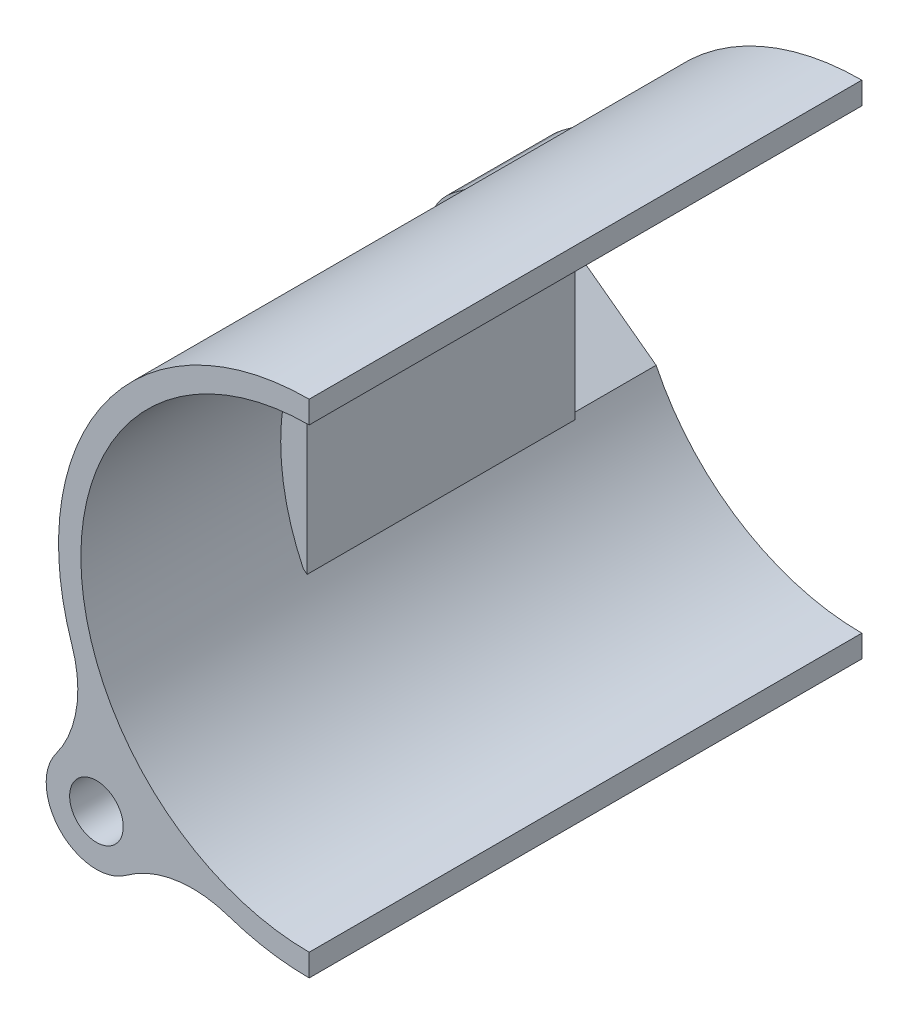
ISO-10303-21;
HEADER;
FILE_DESCRIPTION(('STEP AP214'),'2;1');
FILE_NAME('part.step','',(''),(''),'','','');
FILE_SCHEMA(('AUTOMOTIVE_DESIGN { 1 0 10303 214 1 1 1 1 }'));
ENDSEC;
DATA;
#1=APPLICATION_CONTEXT('core data for automotive mechanical design processes');
#2=APPLICATION_PROTOCOL_DEFINITION('international standard','automotive_design',2000,#1);
#3=PRODUCT_CONTEXT('',#1,'mechanical');
#4=PRODUCT('Part','Part','',(#3));
#5=PRODUCT_RELATED_PRODUCT_CATEGORY('part','',(#4));
#6=PRODUCT_DEFINITION_FORMATION('','',#4);
#7=PRODUCT_DEFINITION_CONTEXT('part definition',#1,'design');
#8=PRODUCT_DEFINITION('design','',#6,#7);
#9=PRODUCT_DEFINITION_SHAPE('','',#8);
#10=(LENGTH_UNIT() NAMED_UNIT(*) SI_UNIT(.MILLI.,.METRE.));
#11=(NAMED_UNIT(*) PLANE_ANGLE_UNIT() SI_UNIT($,.RADIAN.));
#12=(NAMED_UNIT(*) SI_UNIT($,.STERADIAN.) SOLID_ANGLE_UNIT());
#13=UNCERTAINTY_MEASURE_WITH_UNIT(LENGTH_MEASURE(1.E-05),#10,'distance_accuracy_value','');
#14=(GEOMETRIC_REPRESENTATION_CONTEXT(3) GLOBAL_UNCERTAINTY_ASSIGNED_CONTEXT((#13)) GLOBAL_UNIT_ASSIGNED_CONTEXT((#10,
#11,#12)) REPRESENTATION_CONTEXT('',''));
#15=CARTESIAN_POINT('',(0.,0.,0.));
#16=DIRECTION('',(0.,0.,1.));
#17=DIRECTION('',(1.,0.,0.));
#18=AXIS2_PLACEMENT_3D('',#15,#16,#17);
#19=CARTESIAN_POINT('',(0.,0.,0.));
#20=DIRECTION('',(1.,0.,0.));
#21=DIRECTION('',(0.,0.,-1.));
#22=AXIS2_PLACEMENT_3D('',#19,#20,#21);
#23=PLANE('',#22);
#24=DIRECTION('',(0.,0.,-1.));
#25=VECTOR('',#24,1.);
#26=CARTESIAN_POINT('',(0.,-22.45,49.5));
#27=LINE('',#26,#25);
#28=CARTESIAN_POINT('',(0.,-22.45,49.5));
#29=VERTEX_POINT('',#28);
#30=CARTESIAN_POINT('',(0.,-22.45,0.));
#31=VERTEX_POINT('',#30);
#32=EDGE_CURVE('E305',#29,#31,#27,.T.);
#33=ORIENTED_EDGE('',*,*,#32,.T.);
#34=DIRECTION('',(0.,1.,0.));
#35=VECTOR('',#34,1.);
#36=CARTESIAN_POINT('',(0.,0.,0.));
#37=LINE('',#36,#35);
#38=CARTESIAN_POINT('',(0.,-20.45,0.));
#39=VERTEX_POINT('',#38);
#40=EDGE_CURVE('E220',#31,#39,#37,.T.);
#41=ORIENTED_EDGE('',*,*,#40,.T.);
#42=DIRECTION('',(0.,0.,-1.));
#43=VECTOR('',#42,1.);
#44=CARTESIAN_POINT('',(0.,-20.45,49.5));
#45=LINE('',#44,#43);
#46=CARTESIAN_POINT('',(0.,-20.45,49.5));
#47=VERTEX_POINT('',#46);
#48=EDGE_CURVE('E213',#47,#39,#45,.T.);
#49=ORIENTED_EDGE('',*,*,#48,.F.);
#50=DIRECTION('',(0.,1.,0.));
#51=VECTOR('',#50,1.);
#52=CARTESIAN_POINT('',(0.,0.,49.5));
#53=LINE('',#52,#51);
#54=EDGE_CURVE('E212',#29,#47,#53,.T.);
#55=ORIENTED_EDGE('',*,*,#54,.F.);
#56=EDGE_LOOP('',(#33,#41,#49,#55));
#57=FACE_BOUND('',#56,.T.);
#58=ADVANCED_FACE('F44',(#57),#23,.T.);
#59=DIRECTION('',(0.,0.,-1.));
#60=VECTOR('',#59,1.);
#61=CARTESIAN_POINT('',(0.,20.45,49.5));
#62=LINE('',#61,#60);
#63=CARTESIAN_POINT('',(0.,20.45,0.));
#64=VERTEX_POINT('',#63);
#65=CARTESIAN_POINT('',(0.,20.45,49.5));
#66=VERTEX_POINT('',#65);
#67=EDGE_CURVE('E195',#64,#66,#62,.F.);
#68=ORIENTED_EDGE('',*,*,#67,.F.);
#69=CARTESIAN_POINT('',(0.,22.45,0.));
#70=VERTEX_POINT('',#69);
#71=EDGE_CURVE('E210',#64,#70,#37,.T.);
#72=ORIENTED_EDGE('',*,*,#71,.T.);
#73=DIRECTION('',(0.,0.,-1.));
#74=VECTOR('',#73,1.);
#75=CARTESIAN_POINT('',(0.,22.45,49.5));
#76=LINE('',#75,#74);
#77=CARTESIAN_POINT('',(0.,22.45,49.5));
#78=VERTEX_POINT('',#77);
#79=EDGE_CURVE('E223',#70,#78,#76,.F.);
#80=ORIENTED_EDGE('',*,*,#79,.T.);
#81=EDGE_CURVE('E211',#66,#78,#53,.T.);
#82=ORIENTED_EDGE('',*,*,#81,.F.);
#83=EDGE_LOOP('',(#68,#72,#80,#82));
#84=FACE_BOUND('',#83,.T.);
#85=ADVANCED_FACE('F208',(#84),#23,.T.);
#86=CARTESIAN_POINT('',(-23.1,0.,9.6));
#87=DIRECTION('',(0.,0.,1.));
#88=DIRECTION('',(1.,0.,0.));
#89=AXIS2_PLACEMENT_3D('',#86,#87,#88);
#90=CYLINDRICAL_SURFACE('',#89,2.24999999999999);
#91=CARTESIAN_POINT('',(-23.1,0.,9.6));
#92=DIRECTION('',(0.,0.,1.));
#93=DIRECTION('',(1.,0.,0.));
#94=AXIS2_PLACEMENT_3D('',#91,#92,#93);
#95=CIRCLE('',#94,2.24999999999999);
#96=CARTESIAN_POINT('',(-20.85,0.,9.6));
#97=VERTEX_POINT('',#96);
#98=EDGE_CURVE('E249',#97,#97,#95,.T.);
#99=ORIENTED_EDGE('',*,*,#98,.T.);
#100=EDGE_LOOP('',(#99));
#101=FACE_BOUND('',#100,.T.);
#102=CARTESIAN_POINT('',(-23.1,0.,7.6));
#103=DIRECTION('',(0.,0.,1.));
#104=DIRECTION('',(1.,0.,0.));
#105=AXIS2_PLACEMENT_3D('',#102,#103,#104);
#106=CIRCLE('',#105,2.24999999999999);
#107=CARTESIAN_POINT('',(-20.85,0.,7.6));
#108=VERTEX_POINT('',#107);
#109=EDGE_CURVE('E253',#108,#108,#106,.T.);
#110=ORIENTED_EDGE('',*,*,#109,.F.);
#111=EDGE_LOOP('',(#110));
#112=FACE_BOUND('',#111,.T.);
#113=ADVANCED_FACE('F421',(#101,#112),#90,.F.);
#114=CARTESIAN_POINT('',(-18.0802086799942,0.,29.6));
#115=DIRECTION('',(1.,0.,0.));
#116=DIRECTION('',(0.,1.,0.));
#117=AXIS2_PLACEMENT_3D('',#114,#115,#116);
#118=PLANE('',#117);
#119=DIRECTION('',(0.,-1.,0.));
#120=VECTOR('',#119,1.);
#121=CARTESIAN_POINT('',(-18.0802086799942,0.,7.6));
#122=LINE('',#121,#120);
#123=CARTESIAN_POINT('',(-18.0802086799942,9.13194781106274,7.6));
#124=VERTEX_POINT('',#123);
#125=CARTESIAN_POINT('',(-18.0802086799942,-9.13194781106274,7.6));
#126=VERTEX_POINT('',#125);
#127=EDGE_CURVE('E279',#124,#126,#122,.T.);
#128=ORIENTED_EDGE('',*,*,#127,.F.);
#129=DIRECTION('',(0.,0.,-1.));
#130=VECTOR('',#129,1.);
#131=CARTESIAN_POINT('',(-18.0802086799942,9.13194781106274,29.6));
#132=LINE('',#131,#130);
#133=CARTESIAN_POINT('',(-18.0802086799942,9.13194781106274,31.6));
#134=VERTEX_POINT('',#133);
#135=EDGE_CURVE('E274',#134,#124,#132,.T.);
#136=ORIENTED_EDGE('',*,*,#135,.F.);
#137=DIRECTION('',(0.,1.,0.));
#138=VECTOR('',#137,1.);
#139=CARTESIAN_POINT('',(-18.0802086799942,0.,31.6));
#140=LINE('',#139,#138);
#141=CARTESIAN_POINT('',(-18.0802086799942,-9.13194781106274,31.6));
#142=VERTEX_POINT('',#141);
#143=EDGE_CURVE('E285',#142,#134,#140,.T.);
#144=ORIENTED_EDGE('',*,*,#143,.F.);
#145=DIRECTION('',(0.,0.,-1.));
#146=VECTOR('',#145,1.);
#147=CARTESIAN_POINT('',(-18.0802086799942,-9.13194781106274,29.6));
#148=LINE('',#147,#146);
#149=EDGE_CURVE('E271',#142,#126,#148,.T.);
#150=ORIENTED_EDGE('',*,*,#149,.T.);
#151=EDGE_LOOP('',(#128,#136,#144,#150));
#152=FACE_BOUND('',#151,.T.);
#153=ADVANCED_FACE('F417',(#152),#118,.T.);
#154=CARTESIAN_POINT('',(0.,0.,7.6));
#155=DIRECTION('',(0.,0.,1.));
#156=DIRECTION('',(1.,0.,0.));
#157=AXIS2_PLACEMENT_3D('',#154,#155,#156);
#158=PLANE('',#157);
#159=DIRECTION('',(-0.803549382413629,0.595238095238095,0.));
#160=VECTOR('',#159,1.);
#161=CARTESIAN_POINT('',(-10.7738095238095,-14.5442438216867,7.6));
#162=LINE('',#161,#160);
#163=CARTESIAN_POINT('',(-18.421999974947,-8.87876212785612,7.6));
#164=VERTEX_POINT('',#163);
#165=EDGE_CURVE('E273',#126,#164,#162,.T.);
#166=ORIENTED_EDGE('',*,*,#165,.T.);
#167=DIRECTION('',(0.803549382413629,-0.595238095238095,0.));
#168=VECTOR('',#167,1.);
#169=CARTESIAN_POINT('',(-10.7738095238095,-14.5442438216867,7.6));
#170=LINE('',#169,#168);
#171=CARTESIAN_POINT('',(-25.6892857142857,-3.49543981349928,7.6));
#172=VERTEX_POINT('',#171);
#173=EDGE_CURVE('E242',#172,#164,#170,.T.);
#174=ORIENTED_EDGE('',*,*,#173,.F.);
#175=CARTESIAN_POINT('',(-23.1,0.,7.6));
#176=DIRECTION('',(0.,0.,1.));
#177=DIRECTION('',(1.,0.,0.));
#178=AXIS2_PLACEMENT_3D('',#175,#176,#177);
#179=CIRCLE('',#178,4.34999999999999);
#180=CARTESIAN_POINT('',(-25.6892857142857,3.49543981349928,7.6));
#181=VERTEX_POINT('',#180);
#182=EDGE_CURVE('E244',#181,#172,#179,.T.);
#183=ORIENTED_EDGE('',*,*,#182,.F.);
#184=DIRECTION('',(-0.803549382413629,-0.595238095238095,0.));
#185=VECTOR('',#184,1.);
#186=CARTESIAN_POINT('',(-10.7738095238095,14.5442438216867,7.6));
#187=LINE('',#186,#185);
#188=CARTESIAN_POINT('',(-18.421999974947,8.87876212785612,7.6));
#189=VERTEX_POINT('',#188);
#190=EDGE_CURVE('E246',#189,#181,#187,.T.);
#191=ORIENTED_EDGE('',*,*,#190,.F.);
#192=DIRECTION('',(0.803549382413629,0.595238095238095,0.));
#193=VECTOR('',#192,1.);
#194=CARTESIAN_POINT('',(-10.7738095238095,14.5442438216867,7.6));
#195=LINE('',#194,#193);
#196=EDGE_CURVE('E282',#189,#124,#195,.T.);
#197=ORIENTED_EDGE('',*,*,#196,.T.);
#198=ORIENTED_EDGE('',*,*,#127,.T.);
#199=EDGE_LOOP('',(#166,#174,#183,#191,#197,#198));
#200=FACE_BOUND('',#199,.T.);
#201=ORIENTED_EDGE('',*,*,#109,.T.);
#202=EDGE_LOOP('',(#201));
#203=FACE_BOUND('',#202,.T.);
#204=ADVANCED_FACE('F410',(#200,#203),#158,.F.);
#205=CARTESIAN_POINT('',(0.,0.,29.6));
#206=DIRECTION('',(0.,0.,1.));
#207=DIRECTION('',(1.,0.,0.));
#208=AXIS2_PLACEMENT_3D('',#205,#206,#207);
#209=PLANE('',#208);
#210=CARTESIAN_POINT('',(0.,0.,29.6));
#211=DIRECTION('',(0.,0.,1.));
#212=DIRECTION('',(1.,0.,0.));
#213=AXIS2_PLACEMENT_3D('',#210,#211,#212);
#214=CIRCLE('',#213,22.45);
#215=CARTESIAN_POINT('',(-19.0802086799942,11.8299677399337,29.6));
#216=VERTEX_POINT('',#215);
#217=CARTESIAN_POINT('',(-19.0802086799942,-11.8299677399337,29.6));
#218=VERTEX_POINT('',#217);
#219=EDGE_CURVE('E258',#216,#218,#214,.T.);
#220=ORIENTED_EDGE('',*,*,#219,.F.);
#221=DIRECTION('',(0.,-1.,0.));
#222=VECTOR('',#221,1.);
#223=CARTESIAN_POINT('',(-19.0802086799942,0.,29.6));
#224=LINE('',#223,#222);
#225=EDGE_CURVE('E262',#216,#218,#224,.T.);
#226=ORIENTED_EDGE('',*,*,#225,.T.);
#227=EDGE_LOOP('',(#220,#226));
#228=FACE_BOUND('',#227,.T.);
#229=ADVANCED_FACE('F408',(#228),#209,.F.);
#230=CARTESIAN_POINT('',(-19.0802086799942,0.,29.6));
#231=DIRECTION('',(1.,0.,0.));
#232=DIRECTION('',(0.,1.,0.));
#233=AXIS2_PLACEMENT_3D('',#230,#231,#232);
#234=PLANE('',#233);
#235=DIRECTION('',(0.,-1.,0.));
#236=VECTOR('',#235,1.);
#237=CARTESIAN_POINT('',(-19.0802086799942,0.,9.6));
#238=LINE('',#237,#236);
#239=CARTESIAN_POINT('',(-19.0802086799942,11.8299677399337,9.6));
#240=VERTEX_POINT('',#239);
#241=CARTESIAN_POINT('',(-19.0802086799942,-11.8299677399337,9.6));
#242=VERTEX_POINT('',#241);
#243=EDGE_CURVE('E261',#240,#242,#238,.T.);
#244=ORIENTED_EDGE('',*,*,#243,.T.);
#245=DIRECTION('',(0.,0.,-1.));
#246=VECTOR('',#245,1.);
#247=CARTESIAN_POINT('',(-19.0802086799942,-11.8299677399337,29.6));
#248=LINE('',#247,#246);
#249=EDGE_CURVE('E252',#218,#242,#248,.T.);
#250=ORIENTED_EDGE('',*,*,#249,.F.);
#251=ORIENTED_EDGE('',*,*,#225,.F.);
#252=DIRECTION('',(0.,0.,-1.));
#253=VECTOR('',#252,1.);
#254=CARTESIAN_POINT('',(-19.0802086799942,11.8299677399337,29.6));
#255=LINE('',#254,#253);
#256=EDGE_CURVE('E256',#216,#240,#255,.T.);
#257=ORIENTED_EDGE('',*,*,#256,.T.);
#258=EDGE_LOOP('',(#244,#250,#251,#257));
#259=FACE_BOUND('',#258,.T.);
#260=ADVANCED_FACE('F405',(#259),#234,.F.);
#261=CARTESIAN_POINT('',(0.,0.,9.6));
#262=DIRECTION('',(0.,0.,1.));
#263=DIRECTION('',(1.,0.,0.));
#264=AXIS2_PLACEMENT_3D('',#261,#262,#263);
#265=PLANE('',#264);
#266=ORIENTED_EDGE('',*,*,#98,.F.);
#267=EDGE_LOOP('',(#266));
#268=FACE_BOUND('',#267,.T.);
#269=DIRECTION('',(0.803549382413629,-0.595238095238095,0.));
#270=VECTOR('',#269,1.);
#271=CARTESIAN_POINT('',(-11.9642857142857,-16.1513425865139,9.6));
#272=LINE('',#271,#270);
#273=CARTESIAN_POINT('',(-26.8797619047619,-5.10253857832654,9.6));
#274=VERTEX_POINT('',#273);
#275=CARTESIAN_POINT('',(-19.9994782017534,-10.1991848526041,9.6));
#276=VERTEX_POINT('',#275);
#277=EDGE_CURVE('E352',#274,#276,#272,.T.);
#278=ORIENTED_EDGE('',*,*,#277,.T.);
#279=CARTESIAN_POINT('',(0.,0.,9.6));
#280=DIRECTION('',(0.,0.,1.));
#281=DIRECTION('',(1.,0.,0.));
#282=AXIS2_PLACEMENT_3D('',#279,#280,#281);
#283=CIRCLE('',#282,22.45);
#284=EDGE_CURVE('E264',#276,#242,#283,.T.);
#285=ORIENTED_EDGE('',*,*,#284,.T.);
#286=ORIENTED_EDGE('',*,*,#243,.F.);
#287=CARTESIAN_POINT('',(0.,0.,9.6));
#288=DIRECTION('',(0.,0.,1.));
#289=DIRECTION('',(1.,0.,0.));
#290=AXIS2_PLACEMENT_3D('',#287,#288,#289);
#291=CIRCLE('',#290,22.45);
#292=CARTESIAN_POINT('',(-19.9994782017534,10.1991848526041,9.6));
#293=VERTEX_POINT('',#292);
#294=EDGE_CURVE('E259',#240,#293,#291,.T.);
#295=ORIENTED_EDGE('',*,*,#294,.T.);
#296=DIRECTION('',(-0.803549382413629,-0.595238095238095,0.));
#297=VECTOR('',#296,1.);
#298=CARTESIAN_POINT('',(-11.9642857142857,16.1513425865139,9.6));
#299=LINE('',#298,#297);
#300=CARTESIAN_POINT('',(-26.8797619047619,5.10253857832653,9.6));
#301=VERTEX_POINT('',#300);
#302=EDGE_CURVE('E351',#293,#301,#299,.T.);
#303=ORIENTED_EDGE('',*,*,#302,.T.);
#304=CARTESIAN_POINT('',(-23.1,0.,9.6));
#305=DIRECTION('',(0.,0.,1.));
#306=DIRECTION('',(1.,0.,0.));
#307=AXIS2_PLACEMENT_3D('',#304,#305,#306);
#308=CIRCLE('',#307,6.34999999999999);
#309=EDGE_CURVE('E355',#301,#274,#308,.T.);
#310=ORIENTED_EDGE('',*,*,#309,.T.);
#311=EDGE_LOOP('',(#278,#285,#286,#295,#303,#310));
#312=FACE_BOUND('',#311,.T.);
#313=ADVANCED_FACE('F402',(#268,#312),#265,.T.);
#314=CARTESIAN_POINT('',(0.,0.,41.5));
#315=DIRECTION('',(0.,0.,1.));
#316=DIRECTION('',(1.,0.,0.));
#317=AXIS2_PLACEMENT_3D('',#314,#315,#316);
#318=PLANE('',#317);
#319=CARTESIAN_POINT('',(-19.0565277529775,-19.0565277529774,41.5));
#320=DIRECTION('',(0.,0.,1.));
#321=DIRECTION('',(1.,0.,0.));
#322=AXIS2_PLACEMENT_3D('',#319,#320,#321);
#323=CIRCLE('',#322,2.39999999999999);
#324=CARTESIAN_POINT('',(-16.6565277529776,-19.0565277529774,41.5));
#325=VERTEX_POINT('',#324);
#326=EDGE_CURVE('E53',#325,#325,#323,.T.);
#327=ORIENTED_EDGE('',*,*,#326,.T.);
#328=EDGE_LOOP('',(#327));
#329=FACE_BOUND('',#328,.T.);
#330=CARTESIAN_POINT('',(0.,0.,41.5));
#331=DIRECTION('',(0.,0.,1.));
#332=DIRECTION('',(1.,0.,0.));
#333=AXIS2_PLACEMENT_3D('',#330,#331,#332);
#334=CIRCLE('',#333,22.45);
#335=CARTESIAN_POINT('',(-21.2550767331328,-7.22663220792627,41.5));
#336=VERTEX_POINT('',#335);
#337=CARTESIAN_POINT('',(-7.22663220792648,-21.2550767331327,41.5));
#338=VERTEX_POINT('',#337);
#339=EDGE_CURVE('E299',#336,#338,#334,.T.);
#340=ORIENTED_EDGE('',*,*,#339,.T.);
#341=CARTESIAN_POINT('',(-10.4456220555552,-30.7228169260649,41.5));
#342=DIRECTION('',(0.,0.,1.));
#343=DIRECTION('',(1.,0.,0.));
#344=AXIS2_PLACEMENT_3D('',#341,#342,#343);
#345=CIRCLE('',#344,10.);
#346=CARTESIAN_POINT('',(-16.3841777089499,-22.67710025497,41.5));
#347=VERTEX_POINT('',#346);
#348=EDGE_CURVE('E324',#338,#347,#345,.T.);
#349=ORIENTED_EDGE('',*,*,#348,.T.);
#350=CARTESIAN_POINT('',(-19.0565277529776,-19.0565277529774,41.5));
#351=DIRECTION('',(0.,0.,1.));
#352=DIRECTION('',(1.,0.,0.));
#353=AXIS2_PLACEMENT_3D('',#350,#351,#352);
#354=CIRCLE('',#353,4.49999999999999);
#355=CARTESIAN_POINT('',(-22.6771002549702,-16.3841777089497,41.5));
#356=VERTEX_POINT('',#355);
#357=EDGE_CURVE('E295',#356,#347,#354,.T.);
#358=ORIENTED_EDGE('',*,*,#357,.F.);
#359=CARTESIAN_POINT('',(-30.722816926065,-10.4456220555549,41.5));
#360=DIRECTION('',(0.,0.,1.));
#361=DIRECTION('',(1.,0.,0.));
#362=AXIS2_PLACEMENT_3D('',#359,#360,#361);
#363=CIRCLE('',#362,10.);
#364=EDGE_CURVE('E303',#356,#336,#363,.T.);
#365=ORIENTED_EDGE('',*,*,#364,.T.);
#366=EDGE_LOOP('',(#340,#349,#358,#365));
#367=FACE_BOUND('',#366,.T.);
#368=ADVANCED_FACE('F454',(#329,#367),#318,.F.);
#369=CARTESIAN_POINT('',(-10.7738095238095,14.5442438216867,29.6));
#370=DIRECTION('',(-0.595238095238095,0.803549382413629,0.));
#371=DIRECTION('',(-0.803549382413629,-0.595238095238095,0.));
#372=AXIS2_PLACEMENT_3D('',#369,#370,#371);
#373=PLANE('',#372);
#374=ORIENTED_EDGE('',*,*,#196,.F.);
#375=DIRECTION('',(0.,0.,-1.));
#376=VECTOR('',#375,1.);
#377=CARTESIAN_POINT('',(-18.421999974947,8.87876212785612,29.6));
#378=LINE('',#377,#376);
#379=CARTESIAN_POINT('',(-18.421999974947,8.87876212785612,31.6));
#380=VERTEX_POINT('',#379);
#381=EDGE_CURVE('E61',#380,#189,#378,.T.);
#382=ORIENTED_EDGE('',*,*,#381,.F.);
#383=DIRECTION('',(-0.803549382413629,-0.595238095238095,0.));
#384=VECTOR('',#383,1.);
#385=CARTESIAN_POINT('',(-10.7738095238095,14.5442438216867,31.6));
#386=LINE('',#385,#384);
#387=EDGE_CURVE('E293',#134,#380,#386,.T.);
#388=ORIENTED_EDGE('',*,*,#387,.F.);
#389=ORIENTED_EDGE('',*,*,#135,.T.);
#390=EDGE_LOOP('',(#374,#382,#388,#389));
#391=FACE_BOUND('',#390,.T.);
#392=ADVANCED_FACE('F476',(#391),#373,.T.);
#393=CARTESIAN_POINT('',(0.,0.,31.6));
#394=DIRECTION('',(0.,0.,1.));
#395=DIRECTION('',(1.,0.,0.));
#396=AXIS2_PLACEMENT_3D('',#393,#394,#395);
#397=PLANE('',#396);
#398=ORIENTED_EDGE('',*,*,#387,.T.);
#399=CARTESIAN_POINT('',(0.,0.,31.6));
#400=DIRECTION('',(0.,0.,1.));
#401=DIRECTION('',(1.,0.,0.));
#402=AXIS2_PLACEMENT_3D('',#399,#400,#401);
#403=CIRCLE('',#402,20.45);
#404=CARTESIAN_POINT('',(-18.421999974947,-8.87876212785611,31.6));
#405=VERTEX_POINT('',#404);
#406=EDGE_CURVE('E291',#380,#405,#403,.T.);
#407=ORIENTED_EDGE('',*,*,#406,.T.);
#408=DIRECTION('',(0.803549382413629,-0.595238095238095,0.));
#409=VECTOR('',#408,1.);
#410=CARTESIAN_POINT('',(-10.7738095238095,-14.5442438216867,31.6));
#411=LINE('',#410,#409);
#412=EDGE_CURVE('E288',#405,#142,#411,.T.);
#413=ORIENTED_EDGE('',*,*,#412,.T.);
#414=ORIENTED_EDGE('',*,*,#143,.T.);
#415=EDGE_LOOP('',(#398,#407,#413,#414));
#416=FACE_BOUND('',#415,.T.);
#417=ADVANCED_FACE('F473',(#416),#397,.T.);
#418=CARTESIAN_POINT('',(-10.7738095238095,-14.5442438216867,29.6));
#419=DIRECTION('',(-0.595238095238095,-0.803549382413629,0.));
#420=DIRECTION('',(0.803549382413629,-0.595238095238095,0.));
#421=AXIS2_PLACEMENT_3D('',#418,#419,#420);
#422=PLANE('',#421);
#423=ORIENTED_EDGE('',*,*,#149,.F.);
#424=ORIENTED_EDGE('',*,*,#412,.F.);
#425=DIRECTION('',(0.,0.,-1.));
#426=VECTOR('',#425,1.);
#427=CARTESIAN_POINT('',(-18.421999974947,-8.87876212785611,49.5));
#428=LINE('',#427,#426);
#429=EDGE_CURVE('E69',#405,#164,#428,.T.);
#430=ORIENTED_EDGE('',*,*,#429,.T.);
#431=ORIENTED_EDGE('',*,*,#165,.F.);
#432=EDGE_LOOP('',(#423,#424,#430,#431));
#433=FACE_BOUND('',#432,.T.);
#434=ADVANCED_FACE('F437',(#433),#422,.T.);
#435=CARTESIAN_POINT('',(-10.7738095238095,-14.5442438216867,7.6));
#436=DIRECTION('',(0.595238095238095,0.803549382413629,0.));
#437=DIRECTION('',(-0.803549382413629,0.595238095238095,0.));
#438=AXIS2_PLACEMENT_3D('',#435,#436,#437);
#439=PLANE('',#438);
#440=DIRECTION('',(0.803549382413629,-0.595238095238095,0.));
#441=VECTOR('',#440,1.);
#442=CARTESIAN_POINT('',(-10.7738095238095,-14.5442438216867,0.));
#443=LINE('',#442,#441);
#444=CARTESIAN_POINT('',(-25.6892857142857,-3.49543981349928,0.));
#445=VERTEX_POINT('',#444);
#446=CARTESIAN_POINT('',(-18.421999974947,-8.87876212785612,0.));
#447=VERTEX_POINT('',#446);
#448=EDGE_CURVE('E238',#445,#447,#443,.T.);
#449=ORIENTED_EDGE('',*,*,#448,.F.);
#450=DIRECTION('',(0.,0.,-1.));
#451=VECTOR('',#450,1.);
#452=CARTESIAN_POINT('',(-25.6892857142857,-3.49543981349928,7.6));
#453=LINE('',#452,#451);
#454=EDGE_CURVE('E372',#172,#445,#453,.T.);
#455=ORIENTED_EDGE('',*,*,#454,.F.);
#456=ORIENTED_EDGE('',*,*,#173,.T.);
#457=DIRECTION('',(0.,0.,-1.));
#458=VECTOR('',#457,1.);
#459=CARTESIAN_POINT('',(-18.421999974947,-8.87876212785612,7.6));
#460=LINE('',#459,#458);
#461=EDGE_CURVE('E374',#164,#447,#460,.T.);
#462=ORIENTED_EDGE('',*,*,#461,.T.);
#463=EDGE_LOOP('',(#449,#455,#456,#462));
#464=FACE_BOUND('',#463,.T.);
#465=ADVANCED_FACE('F382',(#464),#439,.T.);
#466=CARTESIAN_POINT('',(-23.1,0.,7.6));
#467=DIRECTION('',(0.,0.,-1.));
#468=DIRECTION('',(-1.,0.,0.));
#469=AXIS2_PLACEMENT_3D('',#466,#467,#468);
#470=CYLINDRICAL_SURFACE('',#469,4.34999999999999);
#471=CARTESIAN_POINT('',(-23.1,0.,0.));
#472=DIRECTION('',(0.,0.,1.));
#473=DIRECTION('',(1.,0.,0.));
#474=AXIS2_PLACEMENT_3D('',#471,#472,#473);
#475=CIRCLE('',#474,4.34999999999999);
#476=CARTESIAN_POINT('',(-25.6892857142857,3.49543981349928,0.));
#477=VERTEX_POINT('',#476);
#478=EDGE_CURVE('E235',#477,#445,#475,.T.);
#479=ORIENTED_EDGE('',*,*,#478,.F.);
#480=DIRECTION('',(0.,0.,-1.));
#481=VECTOR('',#480,1.);
#482=CARTESIAN_POINT('',(-25.6892857142857,3.49543981349928,7.6));
#483=LINE('',#482,#481);
#484=EDGE_CURVE('E370',#181,#477,#483,.T.);
#485=ORIENTED_EDGE('',*,*,#484,.F.);
#486=ORIENTED_EDGE('',*,*,#182,.T.);
#487=ORIENTED_EDGE('',*,*,#454,.T.);
#488=EDGE_LOOP('',(#479,#485,#486,#487));
#489=FACE_BOUND('',#488,.T.);
#490=ADVANCED_FACE('F436',(#489),#470,.F.);
#491=CARTESIAN_POINT('',(-10.7738095238095,14.5442438216867,7.6));
#492=DIRECTION('',(0.595238095238095,-0.803549382413629,0.));
#493=DIRECTION('',(0.803549382413629,0.595238095238095,0.));
#494=AXIS2_PLACEMENT_3D('',#491,#492,#493);
#495=PLANE('',#494);
#496=DIRECTION('',(-0.803549382413629,-0.595238095238095,0.));
#497=VECTOR('',#496,1.);
#498=CARTESIAN_POINT('',(-10.7738095238095,14.5442438216867,0.));
#499=LINE('',#498,#497);
#500=CARTESIAN_POINT('',(-18.421999974947,8.87876212785612,0.));
#501=VERTEX_POINT('',#500);
#502=EDGE_CURVE('E232',#501,#477,#499,.T.);
#503=ORIENTED_EDGE('',*,*,#502,.F.);
#504=DIRECTION('',(0.,0.,-1.));
#505=VECTOR('',#504,1.);
#506=CARTESIAN_POINT('',(-18.421999974947,8.87876212785612,7.6));
#507=LINE('',#506,#505);
#508=EDGE_CURVE('E198',#189,#501,#507,.T.);
#509=ORIENTED_EDGE('',*,*,#508,.F.);
#510=ORIENTED_EDGE('',*,*,#190,.T.);
#511=ORIENTED_EDGE('',*,*,#484,.T.);
#512=EDGE_LOOP('',(#503,#509,#510,#511));
#513=FACE_BOUND('',#512,.T.);
#514=ADVANCED_FACE('F440',(#513),#495,.T.);
#515=CARTESIAN_POINT('',(-11.9642857142857,16.1513425865139,7.6));
#516=DIRECTION('',(0.595238095238095,-0.803549382413629,0.));
#517=DIRECTION('',(0.803549382413629,0.595238095238095,0.));
#518=AXIS2_PLACEMENT_3D('',#515,#516,#517);
#519=PLANE('',#518);
#520=DIRECTION('',(-0.803549382413629,-0.595238095238095,0.));
#521=VECTOR('',#520,1.);
#522=CARTESIAN_POINT('',(-11.9642857142857,16.1513425865139,0.));
#523=LINE('',#522,#521);
#524=CARTESIAN_POINT('',(-19.9994782017534,10.1991848526041,0.));
#525=VERTEX_POINT('',#524);
#526=CARTESIAN_POINT('',(-26.8797619047619,5.10253857832653,0.));
#527=VERTEX_POINT('',#526);
#528=EDGE_CURVE('E204',#525,#527,#523,.T.);
#529=ORIENTED_EDGE('',*,*,#528,.T.);
#530=DIRECTION('',(0.,0.,-1.));
#531=VECTOR('',#530,1.);
#532=CARTESIAN_POINT('',(-26.8797619047619,5.10253857832653,7.6));
#533=LINE('',#532,#531);
#534=EDGE_CURVE('E230',#301,#527,#533,.T.);
#535=ORIENTED_EDGE('',*,*,#534,.F.);
#536=ORIENTED_EDGE('',*,*,#302,.F.);
#537=DIRECTION('',(0.,0.,-1.));
#538=VECTOR('',#537,1.);
#539=CARTESIAN_POINT('',(-19.9994782017534,10.1991848526041,9.6));
#540=LINE('',#539,#538);
#541=EDGE_CURVE('E356',#293,#525,#540,.T.);
#542=ORIENTED_EDGE('',*,*,#541,.T.);
#543=EDGE_LOOP('',(#529,#535,#536,#542));
#544=FACE_BOUND('',#543,.T.);
#545=ADVANCED_FACE('F395',(#544),#519,.F.);
#546=CARTESIAN_POINT('',(-23.1,0.,7.6));
#547=DIRECTION('',(0.,0.,-1.));
#548=DIRECTION('',(-1.,0.,0.));
#549=AXIS2_PLACEMENT_3D('',#546,#547,#548);
#550=CYLINDRICAL_SURFACE('',#549,6.34999999999999);
#551=CARTESIAN_POINT('',(-23.1,0.,0.));
#552=DIRECTION('',(0.,0.,1.));
#553=DIRECTION('',(1.,0.,0.));
#554=AXIS2_PLACEMENT_3D('',#551,#552,#553);
#555=CIRCLE('',#554,6.34999999999999);
#556=CARTESIAN_POINT('',(-26.8797619047619,-5.10253857832654,0.));
#557=VERTEX_POINT('',#556);
#558=EDGE_CURVE('E346',#527,#557,#555,.T.);
#559=ORIENTED_EDGE('',*,*,#558,.T.);
#560=DIRECTION('',(0.,0.,1.));
#561=VECTOR('',#560,1.);
#562=CARTESIAN_POINT('',(-26.8797619047619,-5.10253857832654,7.6));
#563=LINE('',#562,#561);
#564=EDGE_CURVE('E358',#274,#557,#563,.F.);
#565=ORIENTED_EDGE('',*,*,#564,.F.);
#566=ORIENTED_EDGE('',*,*,#309,.F.);
#567=ORIENTED_EDGE('',*,*,#534,.T.);
#568=EDGE_LOOP('',(#559,#565,#566,#567));
#569=FACE_BOUND('',#568,.T.);
#570=ADVANCED_FACE('F392',(#569),#550,.T.);
#571=CARTESIAN_POINT('',(-11.9642857142857,-16.1513425865139,7.6));
#572=DIRECTION('',(0.595238095238095,0.803549382413629,0.));
#573=DIRECTION('',(-0.803549382413629,0.595238095238095,0.));
#574=AXIS2_PLACEMENT_3D('',#571,#572,#573);
#575=PLANE('',#574);
#576=DIRECTION('',(0.803549382413629,-0.595238095238095,0.));
#577=VECTOR('',#576,1.);
#578=CARTESIAN_POINT('',(-11.9642857142857,-16.1513425865139,0.));
#579=LINE('',#578,#577);
#580=CARTESIAN_POINT('',(-19.9994782017534,-10.1991848526041,0.));
#581=VERTEX_POINT('',#580);
#582=EDGE_CURVE('E348',#557,#581,#579,.T.);
#583=ORIENTED_EDGE('',*,*,#582,.T.);
#584=DIRECTION('',(0.,0.,-1.));
#585=VECTOR('',#584,1.);
#586=CARTESIAN_POINT('',(-19.9994782017534,-10.1991848526041,9.6));
#587=LINE('',#586,#585);
#588=EDGE_CURVE('E361',#276,#581,#587,.T.);
#589=ORIENTED_EDGE('',*,*,#588,.F.);
#590=ORIENTED_EDGE('',*,*,#277,.F.);
#591=ORIENTED_EDGE('',*,*,#564,.T.);
#592=EDGE_LOOP('',(#583,#589,#590,#591));
#593=FACE_BOUND('',#592,.T.);
#594=ADVANCED_FACE('F389',(#593),#575,.F.);
#595=CARTESIAN_POINT('',(-10.4456220555552,-30.7228169260649,49.5));
#596=DIRECTION('',(0.,0.,-1.));
#597=DIRECTION('',(-1.,0.,0.));
#598=AXIS2_PLACEMENT_3D('',#595,#596,#597);
#599=CYLINDRICAL_SURFACE('',#598,10.);
#600=ORIENTED_EDGE('',*,*,#348,.F.);
#601=DIRECTION('',(0.,0.,-1.));
#602=VECTOR('',#601,1.);
#603=CARTESIAN_POINT('',(-7.22663220792648,-21.2550767331327,49.5));
#604=LINE('',#603,#602);
#605=CARTESIAN_POINT('',(-7.22663220792648,-21.2550767331327,49.5));
#606=VERTEX_POINT('',#605);
#607=EDGE_CURVE('E336',#606,#338,#604,.T.);
#608=ORIENTED_EDGE('',*,*,#607,.F.);
#609=CARTESIAN_POINT('',(-10.4456220555552,-30.7228169260649,49.5));
#610=DIRECTION('',(0.,0.,1.));
#611=DIRECTION('',(1.,0.,0.));
#612=AXIS2_PLACEMENT_3D('',#609,#610,#611);
#613=CIRCLE('',#612,10.);
#614=CARTESIAN_POINT('',(-16.3841777089499,-22.67710025497,49.5));
#615=VERTEX_POINT('',#614);
#616=EDGE_CURVE('E326',#615,#606,#613,.F.);
#617=ORIENTED_EDGE('',*,*,#616,.F.);
#618=DIRECTION('',(0.,0.,1.));
#619=VECTOR('',#618,1.);
#620=CARTESIAN_POINT('',(-16.3841777089499,-22.67710025497,41.5));
#621=LINE('',#620,#619);
#622=EDGE_CURVE('E332',#347,#615,#621,.T.);
#623=ORIENTED_EDGE('',*,*,#622,.F.);
#624=EDGE_LOOP('',(#600,#608,#617,#623));
#625=FACE_BOUND('',#624,.T.);
#626=ADVANCED_FACE('F451',(#625),#599,.F.);
#627=CARTESIAN_POINT('',(-19.0565277529776,-19.0565277529774,41.5));
#628=DIRECTION('',(0.,0.,1.));
#629=DIRECTION('',(1.,0.,0.));
#630=AXIS2_PLACEMENT_3D('',#627,#628,#629);
#631=CYLINDRICAL_SURFACE('',#630,4.49999999999999);
#632=ORIENTED_EDGE('',*,*,#357,.T.);
#633=ORIENTED_EDGE('',*,*,#622,.T.);
#634=CARTESIAN_POINT('',(-19.0565277529776,-19.0565277529774,49.5));
#635=DIRECTION('',(0.,0.,1.));
#636=DIRECTION('',(1.,0.,0.));
#637=AXIS2_PLACEMENT_3D('',#634,#635,#636);
#638=CIRCLE('',#637,4.49999999999999);
#639=CARTESIAN_POINT('',(-22.6771002549702,-16.3841777089497,49.5));
#640=VERTEX_POINT('',#639);
#641=EDGE_CURVE('E296',#640,#615,#638,.T.);
#642=ORIENTED_EDGE('',*,*,#641,.F.);
#643=DIRECTION('',(0.,0.,1.));
#644=VECTOR('',#643,1.);
#645=CARTESIAN_POINT('',(-22.6771002549702,-16.3841777089497,41.5));
#646=LINE('',#645,#644);
#647=EDGE_CURVE('E323',#640,#356,#646,.F.);
#648=ORIENTED_EDGE('',*,*,#647,.T.);
#649=EDGE_LOOP('',(#632,#633,#642,#648));
#650=FACE_BOUND('',#649,.T.);
#651=ADVANCED_FACE('F458',(#650),#631,.T.);
#652=CARTESIAN_POINT('',(-30.722816926065,-10.4456220555549,41.5));
#653=DIRECTION('',(0.,0.,-1.));
#654=DIRECTION('',(-1.,0.,0.));
#655=AXIS2_PLACEMENT_3D('',#652,#653,#654);
#656=CYLINDRICAL_SURFACE('',#655,10.);
#657=ORIENTED_EDGE('',*,*,#364,.F.);
#658=ORIENTED_EDGE('',*,*,#647,.F.);
#659=CARTESIAN_POINT('',(-30.722816926065,-10.4456220555549,49.5));
#660=DIRECTION('',(0.,0.,1.));
#661=DIRECTION('',(1.,0.,0.));
#662=AXIS2_PLACEMENT_3D('',#659,#660,#661);
#663=CIRCLE('',#662,10.);
#664=CARTESIAN_POINT('',(-21.2550767331328,-7.22663220792627,49.5));
#665=VERTEX_POINT('',#664);
#666=EDGE_CURVE('E317',#665,#640,#663,.F.);
#667=ORIENTED_EDGE('',*,*,#666,.F.);
#668=DIRECTION('',(0.,0.,-1.));
#669=VECTOR('',#668,1.);
#670=CARTESIAN_POINT('',(-21.2550767331328,-7.22663220792627,49.5));
#671=LINE('',#670,#669);
#672=EDGE_CURVE('E229',#336,#665,#671,.F.);
#673=ORIENTED_EDGE('',*,*,#672,.F.);
#674=EDGE_LOOP('',(#657,#658,#667,#673));
#675=FACE_BOUND('',#674,.T.);
#676=ADVANCED_FACE('F322',(#675),#656,.F.);
#677=CARTESIAN_POINT('',(0.,0.,49.5));
#678=DIRECTION('',(0.,0.,-1.));
#679=DIRECTION('',(-1.,0.,0.));
#680=AXIS2_PLACEMENT_3D('',#677,#678,#679);
#681=CYLINDRICAL_SURFACE('',#680,20.45);
#682=CARTESIAN_POINT('',(0.,0.,49.5));
#683=DIRECTION('',(0.,0.,1.));
#684=DIRECTION('',(1.,0.,0.));
#685=AXIS2_PLACEMENT_3D('',#682,#683,#684);
#686=CIRCLE('',#685,20.45);
#687=EDGE_CURVE('E231',#66,#47,#686,.T.);
#688=ORIENTED_EDGE('',*,*,#687,.T.);
#689=ORIENTED_EDGE('',*,*,#48,.T.);
#690=CARTESIAN_POINT('',(0.,0.,0.));
#691=DIRECTION('',(0.,0.,1.));
#692=DIRECTION('',(1.,0.,0.));
#693=AXIS2_PLACEMENT_3D('',#690,#691,#692);
#694=CIRCLE('',#693,20.45);
#695=EDGE_CURVE('E203',#447,#39,#694,.T.);
#696=ORIENTED_EDGE('',*,*,#695,.F.);
#697=ORIENTED_EDGE('',*,*,#461,.F.);
#698=ORIENTED_EDGE('',*,*,#429,.F.);
#699=ORIENTED_EDGE('',*,*,#406,.F.);
#700=ORIENTED_EDGE('',*,*,#381,.T.);
#701=ORIENTED_EDGE('',*,*,#508,.T.);
#702=EDGE_CURVE('E191',#64,#501,#694,.T.);
#703=ORIENTED_EDGE('',*,*,#702,.F.);
#704=ORIENTED_EDGE('',*,*,#67,.T.);
#705=EDGE_LOOP('',(#688,#689,#696,#697,#698,#699,#700,#701,#703,#704));
#706=FACE_BOUND('',#705,.T.);
#707=ADVANCED_FACE('F194',(#706),#681,.F.);
#708=CARTESIAN_POINT('',(0.,0.,49.5));
#709=DIRECTION('',(0.,0.,-1.));
#710=DIRECTION('',(-1.,0.,0.));
#711=AXIS2_PLACEMENT_3D('',#708,#709,#710);
#712=CYLINDRICAL_SURFACE('',#711,22.45);
#713=ORIENTED_EDGE('',*,*,#32,.F.);
#714=CARTESIAN_POINT('',(0.,0.,49.5));
#715=DIRECTION('',(0.,0.,1.));
#716=DIRECTION('',(1.,0.,0.));
#717=AXIS2_PLACEMENT_3D('',#714,#715,#716);
#718=CIRCLE('',#717,22.45);
#719=EDGE_CURVE('E234',#606,#29,#718,.T.);
#720=ORIENTED_EDGE('',*,*,#719,.F.);
#721=ORIENTED_EDGE('',*,*,#607,.T.);
#722=ORIENTED_EDGE('',*,*,#339,.F.);
#723=ORIENTED_EDGE('',*,*,#672,.T.);
#724=EDGE_CURVE('E48',#78,#665,#718,.T.);
#725=ORIENTED_EDGE('',*,*,#724,.F.);
#726=ORIENTED_EDGE('',*,*,#79,.F.);
#727=CARTESIAN_POINT('',(0.,0.,0.));
#728=DIRECTION('',(0.,0.,1.));
#729=DIRECTION('',(1.,0.,0.));
#730=AXIS2_PLACEMENT_3D('',#727,#728,#729);
#731=CIRCLE('',#730,22.45);
#732=EDGE_CURVE('E218',#70,#525,#731,.T.);
#733=ORIENTED_EDGE('',*,*,#732,.T.);
#734=ORIENTED_EDGE('',*,*,#541,.F.);
#735=ORIENTED_EDGE('',*,*,#294,.F.);
#736=ORIENTED_EDGE('',*,*,#256,.F.);
#737=ORIENTED_EDGE('',*,*,#219,.T.);
#738=ORIENTED_EDGE('',*,*,#249,.T.);
#739=ORIENTED_EDGE('',*,*,#284,.F.);
#740=ORIENTED_EDGE('',*,*,#588,.T.);
#741=CARTESIAN_POINT('',(0.,0.,0.));
#742=DIRECTION('',(0.,0.,1.));
#743=DIRECTION('',(1.,0.,0.));
#744=AXIS2_PLACEMENT_3D('',#741,#742,#743);
#745=CIRCLE('',#744,22.45);
#746=EDGE_CURVE('E228',#581,#31,#745,.T.);
#747=ORIENTED_EDGE('',*,*,#746,.T.);
#748=EDGE_LOOP('',(#713,#720,#721,#722,#723,#725,#726,#733,#734,#735,#736,#737,#738,#739,#740,#747));
#749=FACE_BOUND('',#748,.T.);
#750=ADVANCED_FACE('F312',(#749),#712,.T.);
#751=CARTESIAN_POINT('',(-19.0565277529775,-19.0565277529774,49.5));
#752=DIRECTION('',(0.,0.,1.));
#753=DIRECTION('',(1.,0.,0.));
#754=AXIS2_PLACEMENT_3D('',#751,#752,#753);
#755=CYLINDRICAL_SURFACE('',#754,2.39999999999999);
#756=CARTESIAN_POINT('',(-19.0565277529775,-19.0565277529774,49.5));
#757=DIRECTION('',(0.,0.,1.));
#758=DIRECTION('',(1.,0.,0.));
#759=AXIS2_PLACEMENT_3D('',#756,#757,#758);
#760=CIRCLE('',#759,2.39999999999999);
#761=CARTESIAN_POINT('',(-16.6565277529776,-19.0565277529774,49.5));
#762=VERTEX_POINT('',#761);
#763=EDGE_CURVE('E11',#762,#762,#760,.T.);
#764=ORIENTED_EDGE('',*,*,#763,.T.);
#765=EDGE_LOOP('',(#764));
#766=FACE_BOUND('',#765,.T.);
#767=ORIENTED_EDGE('',*,*,#326,.F.);
#768=EDGE_LOOP('',(#767));
#769=FACE_BOUND('',#768,.T.);
#770=ADVANCED_FACE('F478',(#766,#769),#755,.F.);
#771=CARTESIAN_POINT('',(0.,0.,49.5));
#772=DIRECTION('',(0.,0.,1.));
#773=DIRECTION('',(1.,0.,0.));
#774=AXIS2_PLACEMENT_3D('',#771,#772,#773);
#775=PLANE('',#774);
#776=ORIENTED_EDGE('',*,*,#763,.F.);
#777=EDGE_LOOP('',(#776));
#778=FACE_BOUND('',#777,.T.);
#779=ORIENTED_EDGE('',*,*,#719,.T.);
#780=ORIENTED_EDGE('',*,*,#54,.T.);
#781=ORIENTED_EDGE('',*,*,#687,.F.);
#782=ORIENTED_EDGE('',*,*,#81,.T.);
#783=ORIENTED_EDGE('',*,*,#724,.T.);
#784=ORIENTED_EDGE('',*,*,#666,.T.);
#785=ORIENTED_EDGE('',*,*,#641,.T.);
#786=ORIENTED_EDGE('',*,*,#616,.T.);
#787=EDGE_LOOP('',(#779,#780,#781,#782,#783,#784,#785,#786));
#788=FACE_BOUND('',#787,.T.);
#789=ADVANCED_FACE('F46',(#778,#788),#775,.T.);
#790=CARTESIAN_POINT('',(0.,0.,0.));
#791=DIRECTION('',(0.,0.,1.));
#792=DIRECTION('',(1.,0.,0.));
#793=AXIS2_PLACEMENT_3D('',#790,#791,#792);
#794=PLANE('',#793);
#795=ORIENTED_EDGE('',*,*,#40,.F.);
#796=ORIENTED_EDGE('',*,*,#746,.F.);
#797=ORIENTED_EDGE('',*,*,#582,.F.);
#798=ORIENTED_EDGE('',*,*,#558,.F.);
#799=ORIENTED_EDGE('',*,*,#528,.F.);
#800=ORIENTED_EDGE('',*,*,#732,.F.);
#801=ORIENTED_EDGE('',*,*,#71,.F.);
#802=ORIENTED_EDGE('',*,*,#702,.T.);
#803=ORIENTED_EDGE('',*,*,#502,.T.);
#804=ORIENTED_EDGE('',*,*,#478,.T.);
#805=ORIENTED_EDGE('',*,*,#448,.T.);
#806=ORIENTED_EDGE('',*,*,#695,.T.);
#807=EDGE_LOOP('',(#795,#796,#797,#798,#799,#800,#801,#802,#803,#804,#805,#806));
#808=FACE_BOUND('',#807,.T.);
#809=ADVANCED_FACE('F216',(#808),#794,.F.);
#810=CLOSED_SHELL('',(#58,#85,#113,#153,#204,#229,#260,#313,#368,#392,#417,#434,#465,#490,#514,
#545,#570,#594,#626,#651,#676,#707,#750,#770,#789,#809));
#811=MANIFOLD_SOLID_BREP('B2',#810);
#812=ADVANCED_BREP_SHAPE_REPRESENTATION('',(#18,#811),#14);
#813=SHAPE_DEFINITION_REPRESENTATION(#9,#812);
ENDSEC;
END-ISO-10303-21;
